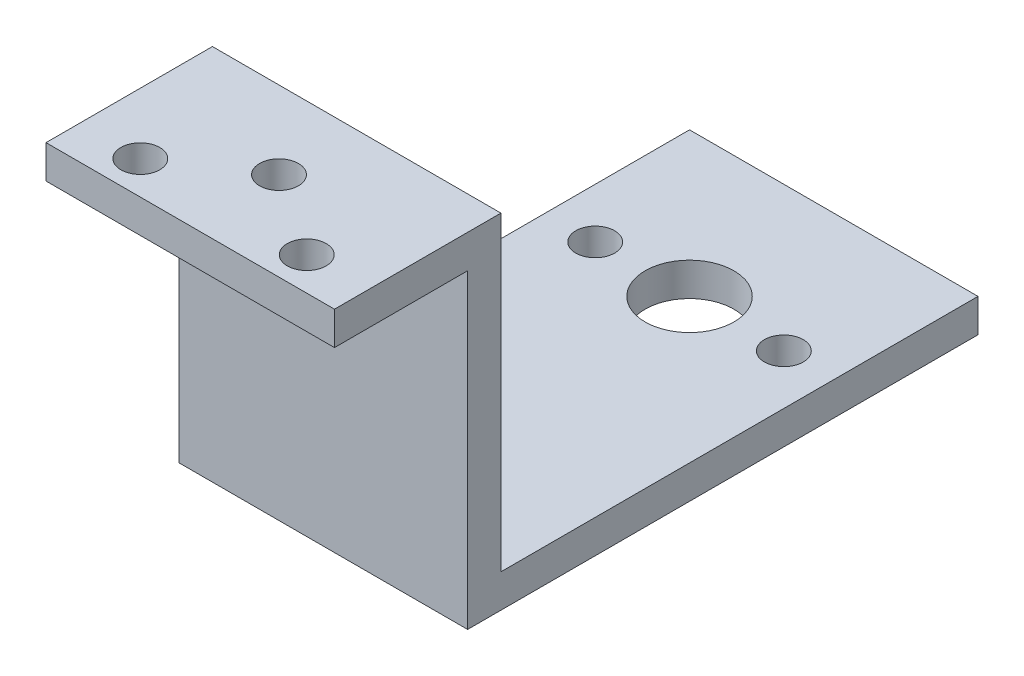
ISO-10303-21;
HEADER;
FILE_DESCRIPTION(('STEP AP214'),'2;1');
FILE_NAME('part.step','',(''),(''),'','','');
FILE_SCHEMA(('AUTOMOTIVE_DESIGN { 1 0 10303 214 1 1 1 1 }'));
ENDSEC;
DATA;
#1=APPLICATION_CONTEXT('core data for automotive mechanical design processes');
#2=APPLICATION_PROTOCOL_DEFINITION('international standard','automotive_design',2000,#1);
#3=PRODUCT_CONTEXT('',#1,'mechanical');
#4=PRODUCT('Part','Part','',(#3));
#5=PRODUCT_RELATED_PRODUCT_CATEGORY('part','',(#4));
#6=PRODUCT_DEFINITION_FORMATION('','',#4);
#7=PRODUCT_DEFINITION_CONTEXT('part definition',#1,'design');
#8=PRODUCT_DEFINITION('design','',#6,#7);
#9=PRODUCT_DEFINITION_SHAPE('','',#8);
#10=(LENGTH_UNIT() NAMED_UNIT(*) SI_UNIT(.MILLI.,.METRE.));
#11=(NAMED_UNIT(*) PLANE_ANGLE_UNIT() SI_UNIT($,.RADIAN.));
#12=(NAMED_UNIT(*) SI_UNIT($,.STERADIAN.) SOLID_ANGLE_UNIT());
#13=UNCERTAINTY_MEASURE_WITH_UNIT(LENGTH_MEASURE(1.E-05),#10,'distance_accuracy_value','');
#14=(GEOMETRIC_REPRESENTATION_CONTEXT(3) GLOBAL_UNCERTAINTY_ASSIGNED_CONTEXT((#13)) GLOBAL_UNIT_ASSIGNED_CONTEXT((#10,
#11,#12)) REPRESENTATION_CONTEXT('',''));
#15=CARTESIAN_POINT('',(0.,0.,0.));
#16=DIRECTION('',(0.,0.,1.));
#17=DIRECTION('',(1.,0.,0.));
#18=AXIS2_PLACEMENT_3D('',#15,#16,#17);
#19=CARTESIAN_POINT('',(0.,3.,0.));
#20=DIRECTION('',(0.,1.,0.));
#21=DIRECTION('',(0.,0.,1.));
#22=AXIS2_PLACEMENT_3D('',#19,#20,#21);
#23=PLANE('',#22);
#24=CARTESIAN_POINT('',(8.5,3.,0.));
#25=DIRECTION('',(0.,1.,0.));
#26=DIRECTION('',(0.,0.,1.));
#27=AXIS2_PLACEMENT_3D('',#24,#25,#26);
#28=CIRCLE('',#27,1.75);
#29=CARTESIAN_POINT('',(8.5,3.,1.75));
#30=VERTEX_POINT('',#29);
#31=EDGE_CURVE('E248',#30,#30,#28,.T.);
#32=ORIENTED_EDGE('',*,*,#31,.F.);
#33=EDGE_LOOP('',(#32));
#34=FACE_BOUND('',#33,.T.);
#35=DIRECTION('',(0.,0.,-1.));
#36=VECTOR('',#35,1.);
#37=CARTESIAN_POINT('',(13.,3.,30.));
#38=LINE('',#37,#36);
#39=CARTESIAN_POINT('',(13.,3.,30.));
#40=VERTEX_POINT('',#39);
#41=CARTESIAN_POINT('',(13.,3.,-13.));
#42=VERTEX_POINT('',#41);
#43=EDGE_CURVE('E14',#40,#42,#38,.T.);
#44=ORIENTED_EDGE('',*,*,#43,.T.);
#45=DIRECTION('',(1.,0.,0.));
#46=VECTOR('',#45,1.);
#47=CARTESIAN_POINT('',(0.,3.,-13.));
#48=LINE('',#47,#46);
#49=CARTESIAN_POINT('',(-13.,3.,-13.));
#50=VERTEX_POINT('',#49);
#51=EDGE_CURVE('E143',#50,#42,#48,.T.);
#52=ORIENTED_EDGE('',*,*,#51,.F.);
#53=DIRECTION('',(0.,0.,1.));
#54=VECTOR('',#53,1.);
#55=CARTESIAN_POINT('',(-13.,3.,0.));
#56=LINE('',#55,#54);
#57=CARTESIAN_POINT('',(-13.,3.,30.));
#58=VERTEX_POINT('',#57);
#59=EDGE_CURVE('E264',#50,#58,#56,.T.);
#60=ORIENTED_EDGE('',*,*,#59,.T.);
#61=DIRECTION('',(1.,0.,0.));
#62=VECTOR('',#61,1.);
#63=CARTESIAN_POINT('',(-13.,3.,30.));
#64=LINE('',#63,#62);
#65=EDGE_CURVE('E85',#58,#40,#64,.T.);
#66=ORIENTED_EDGE('',*,*,#65,.T.);
#67=EDGE_LOOP('',(#44,#52,#60,#66));
#68=FACE_BOUND('',#67,.T.);
#69=CARTESIAN_POINT('',(0.,3.,0.));
#70=DIRECTION('',(0.,1.,0.));
#71=DIRECTION('',(0.,0.,1.));
#72=AXIS2_PLACEMENT_3D('',#69,#70,#71);
#73=CIRCLE('',#72,4.);
#74=CARTESIAN_POINT('',(0.,3.,4.));
#75=VERTEX_POINT('',#74);
#76=EDGE_CURVE('E256',#75,#75,#73,.T.);
#77=ORIENTED_EDGE('',*,*,#76,.F.);
#78=EDGE_LOOP('',(#77));
#79=FACE_BOUND('',#78,.T.);
#80=CARTESIAN_POINT('',(-8.5,3.,0.));
#81=DIRECTION('',(0.,1.,0.));
#82=DIRECTION('',(0.,0.,1.));
#83=AXIS2_PLACEMENT_3D('',#80,#81,#82);
#84=CIRCLE('',#83,1.75);
#85=CARTESIAN_POINT('',(-8.5,3.,1.75));
#86=VERTEX_POINT('',#85);
#87=EDGE_CURVE('E240',#86,#86,#84,.T.);
#88=ORIENTED_EDGE('',*,*,#87,.F.);
#89=EDGE_LOOP('',(#88));
#90=FACE_BOUND('',#89,.T.);
#91=ADVANCED_FACE('F75',(#34,#68,#79,#90),#23,.T.);
#92=CARTESIAN_POINT('',(0.,0.,0.));
#93=DIRECTION('',(0.,1.,0.));
#94=DIRECTION('',(0.,0.,1.));
#95=AXIS2_PLACEMENT_3D('',#92,#93,#94);
#96=PLANE('',#95);
#97=DIRECTION('',(1.,0.,0.));
#98=VECTOR('',#97,1.);
#99=CARTESIAN_POINT('',(0.,0.,-13.));
#100=LINE('',#99,#98);
#101=CARTESIAN_POINT('',(-13.,0.,-13.));
#102=VERTEX_POINT('',#101);
#103=CARTESIAN_POINT('',(13.,0.,-13.));
#104=VERTEX_POINT('',#103);
#105=EDGE_CURVE('E155',#102,#104,#100,.T.);
#106=ORIENTED_EDGE('',*,*,#105,.T.);
#107=DIRECTION('',(0.,0.,-1.));
#108=VECTOR('',#107,1.);
#109=CARTESIAN_POINT('',(13.,0.,30.));
#110=LINE('',#109,#108);
#111=CARTESIAN_POINT('',(13.,0.,33.));
#112=VERTEX_POINT('',#111);
#113=EDGE_CURVE('E79',#112,#104,#110,.T.);
#114=ORIENTED_EDGE('',*,*,#113,.F.);
#115=DIRECTION('',(1.,0.,0.));
#116=VECTOR('',#115,1.);
#117=CARTESIAN_POINT('',(-47.4383507154451,0.,33.));
#118=LINE('',#117,#116);
#119=CARTESIAN_POINT('',(-13.,0.,33.));
#120=VERTEX_POINT('',#119);
#121=EDGE_CURVE('E195',#120,#112,#118,.T.);
#122=ORIENTED_EDGE('',*,*,#121,.F.);
#123=DIRECTION('',(0.,0.,1.));
#124=VECTOR('',#123,1.);
#125=CARTESIAN_POINT('',(-13.,0.,0.));
#126=LINE('',#125,#124);
#127=EDGE_CURVE('E260',#102,#120,#126,.T.);
#128=ORIENTED_EDGE('',*,*,#127,.F.);
#129=EDGE_LOOP('',(#106,#114,#122,#128));
#130=FACE_BOUND('',#129,.T.);
#131=CARTESIAN_POINT('',(0.,0.,0.));
#132=DIRECTION('',(0.,1.,0.));
#133=DIRECTION('',(0.,0.,1.));
#134=AXIS2_PLACEMENT_3D('',#131,#132,#133);
#135=CIRCLE('',#134,4.);
#136=CARTESIAN_POINT('',(0.,0.,4.));
#137=VERTEX_POINT('',#136);
#138=EDGE_CURVE('E252',#137,#137,#135,.T.);
#139=ORIENTED_EDGE('',*,*,#138,.T.);
#140=EDGE_LOOP('',(#139));
#141=FACE_BOUND('',#140,.T.);
#142=CARTESIAN_POINT('',(8.5,0.,0.));
#143=DIRECTION('',(0.,1.,0.));
#144=DIRECTION('',(0.,0.,1.));
#145=AXIS2_PLACEMENT_3D('',#142,#143,#144);
#146=CIRCLE('',#145,1.75);
#147=CARTESIAN_POINT('',(8.5,0.,1.75));
#148=VERTEX_POINT('',#147);
#149=EDGE_CURVE('E244',#148,#148,#146,.T.);
#150=ORIENTED_EDGE('',*,*,#149,.T.);
#151=EDGE_LOOP('',(#150));
#152=FACE_BOUND('',#151,.T.);
#153=CARTESIAN_POINT('',(-8.5,0.,0.));
#154=DIRECTION('',(0.,1.,0.));
#155=DIRECTION('',(0.,0.,1.));
#156=AXIS2_PLACEMENT_3D('',#153,#154,#155);
#157=CIRCLE('',#156,1.75);
#158=CARTESIAN_POINT('',(-8.5,0.,1.75));
#159=VERTEX_POINT('',#158);
#160=EDGE_CURVE('E239',#159,#159,#157,.T.);
#161=ORIENTED_EDGE('',*,*,#160,.T.);
#162=EDGE_LOOP('',(#161));
#163=FACE_BOUND('',#162,.T.);
#164=ADVANCED_FACE('F343',(#130,#141,#152,#163),#96,.F.);
#165=CARTESIAN_POINT('',(-13.,3.,0.));
#166=DIRECTION('',(1.,0.,0.));
#167=DIRECTION('',(0.,0.,-1.));
#168=AXIS2_PLACEMENT_3D('',#165,#166,#167);
#169=PLANE('',#168);
#170=ORIENTED_EDGE('',*,*,#127,.T.);
#171=DIRECTION('',(0.,1.,0.));
#172=VECTOR('',#171,1.);
#173=CARTESIAN_POINT('',(-13.,28.,33.));
#174=LINE('',#173,#172);
#175=CARTESIAN_POINT('',(-13.,28.,33.));
#176=VERTEX_POINT('',#175);
#177=EDGE_CURVE('E201',#120,#176,#174,.T.);
#178=ORIENTED_EDGE('',*,*,#177,.T.);
#179=DIRECTION('',(0.,0.,1.));
#180=VECTOR('',#179,1.);
#181=CARTESIAN_POINT('',(-13.,28.,45.));
#182=LINE('',#181,#180);
#183=CARTESIAN_POINT('',(-13.,28.,45.));
#184=VERTEX_POINT('',#183);
#185=EDGE_CURVE('E198',#176,#184,#182,.T.);
#186=ORIENTED_EDGE('',*,*,#185,.T.);
#187=DIRECTION('',(0.,1.,0.));
#188=VECTOR('',#187,1.);
#189=CARTESIAN_POINT('',(-13.,31.,45.));
#190=LINE('',#189,#188);
#191=CARTESIAN_POINT('',(-13.,31.,45.));
#192=VERTEX_POINT('',#191);
#193=EDGE_CURVE('E194',#184,#192,#190,.T.);
#194=ORIENTED_EDGE('',*,*,#193,.T.);
#195=DIRECTION('',(0.,0.,-1.));
#196=VECTOR('',#195,1.);
#197=CARTESIAN_POINT('',(-13.,31.,30.));
#198=LINE('',#197,#196);
#199=CARTESIAN_POINT('',(-13.,31.,30.));
#200=VERTEX_POINT('',#199);
#201=EDGE_CURVE('E191',#192,#200,#198,.T.);
#202=ORIENTED_EDGE('',*,*,#201,.T.);
#203=DIRECTION('',(0.,-1.,0.));
#204=VECTOR('',#203,1.);
#205=CARTESIAN_POINT('',(-13.,3.,30.));
#206=LINE('',#205,#204);
#207=EDGE_CURVE('E204',#200,#58,#206,.T.);
#208=ORIENTED_EDGE('',*,*,#207,.T.);
#209=ORIENTED_EDGE('',*,*,#59,.F.);
#210=DIRECTION('',(0.,-1.,0.));
#211=VECTOR('',#210,1.);
#212=CARTESIAN_POINT('',(-13.,21.3847763108502,-13.));
#213=LINE('',#212,#211);
#214=EDGE_CURVE('E153',#50,#102,#213,.T.);
#215=ORIENTED_EDGE('',*,*,#214,.T.);
#216=EDGE_LOOP('',(#170,#178,#186,#194,#202,#208,#209,#215));
#217=FACE_BOUND('',#216,.T.);
#218=ADVANCED_FACE('F77',(#217),#169,.F.);
#219=CARTESIAN_POINT('',(13.,3.,30.));
#220=DIRECTION('',(-1.,0.,0.));
#221=DIRECTION('',(0.,0.,1.));
#222=AXIS2_PLACEMENT_3D('',#219,#220,#221);
#223=PLANE('',#222);
#224=ORIENTED_EDGE('',*,*,#113,.T.);
#225=DIRECTION('',(0.,-1.,0.));
#226=VECTOR('',#225,1.);
#227=CARTESIAN_POINT('',(13.,21.3847763108502,-13.));
#228=LINE('',#227,#226);
#229=EDGE_CURVE('E151',#42,#104,#228,.T.);
#230=ORIENTED_EDGE('',*,*,#229,.F.);
#231=ORIENTED_EDGE('',*,*,#43,.F.);
#232=DIRECTION('',(0.,1.,0.));
#233=VECTOR('',#232,1.);
#234=CARTESIAN_POINT('',(13.,3.,30.));
#235=LINE('',#234,#233);
#236=CARTESIAN_POINT('',(13.,31.,30.));
#237=VERTEX_POINT('',#236);
#238=EDGE_CURVE('E93',#40,#237,#235,.T.);
#239=ORIENTED_EDGE('',*,*,#238,.T.);
#240=DIRECTION('',(0.,0.,1.));
#241=VECTOR('',#240,1.);
#242=CARTESIAN_POINT('',(13.,31.,30.));
#243=LINE('',#242,#241);
#244=CARTESIAN_POINT('',(13.,31.,45.));
#245=VERTEX_POINT('',#244);
#246=EDGE_CURVE('E207',#237,#245,#243,.T.);
#247=ORIENTED_EDGE('',*,*,#246,.T.);
#248=DIRECTION('',(0.,-1.,0.));
#249=VECTOR('',#248,1.);
#250=CARTESIAN_POINT('',(13.,31.,45.));
#251=LINE('',#250,#249);
#252=CARTESIAN_POINT('',(13.,28.,45.));
#253=VERTEX_POINT('',#252);
#254=EDGE_CURVE('E211',#245,#253,#251,.T.);
#255=ORIENTED_EDGE('',*,*,#254,.T.);
#256=DIRECTION('',(0.,0.,-1.));
#257=VECTOR('',#256,1.);
#258=CARTESIAN_POINT('',(13.,28.,45.));
#259=LINE('',#258,#257);
#260=CARTESIAN_POINT('',(13.,28.,33.));
#261=VERTEX_POINT('',#260);
#262=EDGE_CURVE('E215',#253,#261,#259,.T.);
#263=ORIENTED_EDGE('',*,*,#262,.T.);
#264=DIRECTION('',(0.,-1.,0.));
#265=VECTOR('',#264,1.);
#266=CARTESIAN_POINT('',(13.,28.,33.));
#267=LINE('',#266,#265);
#268=EDGE_CURVE('E219',#261,#112,#267,.T.);
#269=ORIENTED_EDGE('',*,*,#268,.T.);
#270=EDGE_LOOP('',(#224,#230,#231,#239,#247,#255,#263,#269));
#271=FACE_BOUND('',#270,.T.);
#272=ADVANCED_FACE('F157',(#271),#223,.F.);
#273=CARTESIAN_POINT('',(0.,3.,0.));
#274=DIRECTION('',(0.,-1.,0.));
#275=DIRECTION('',(0.,0.,-1.));
#276=AXIS2_PLACEMENT_3D('',#273,#274,#275);
#277=CYLINDRICAL_SURFACE('',#276,4.);
#278=ORIENTED_EDGE('',*,*,#76,.T.);
#279=EDGE_LOOP('',(#278));
#280=FACE_BOUND('',#279,.T.);
#281=ORIENTED_EDGE('',*,*,#138,.F.);
#282=EDGE_LOOP('',(#281));
#283=FACE_BOUND('',#282,.T.);
#284=ADVANCED_FACE('F364',(#280,#283),#277,.F.);
#285=CARTESIAN_POINT('',(8.5,3.,0.));
#286=DIRECTION('',(0.,-1.,0.));
#287=DIRECTION('',(0.,0.,-1.));
#288=AXIS2_PLACEMENT_3D('',#285,#286,#287);
#289=CYLINDRICAL_SURFACE('',#288,1.75);
#290=ORIENTED_EDGE('',*,*,#31,.T.);
#291=EDGE_LOOP('',(#290));
#292=FACE_BOUND('',#291,.T.);
#293=ORIENTED_EDGE('',*,*,#149,.F.);
#294=EDGE_LOOP('',(#293));
#295=FACE_BOUND('',#294,.T.);
#296=ADVANCED_FACE('F356',(#292,#295),#289,.F.);
#297=CARTESIAN_POINT('',(-8.5,3.,0.));
#298=DIRECTION('',(0.,-1.,0.));
#299=DIRECTION('',(0.,0.,-1.));
#300=AXIS2_PLACEMENT_3D('',#297,#298,#299);
#301=CYLINDRICAL_SURFACE('',#300,1.75);
#302=ORIENTED_EDGE('',*,*,#87,.T.);
#303=EDGE_LOOP('',(#302));
#304=FACE_BOUND('',#303,.T.);
#305=ORIENTED_EDGE('',*,*,#160,.F.);
#306=EDGE_LOOP('',(#305));
#307=FACE_BOUND('',#306,.T.);
#308=ADVANCED_FACE('F353',(#304,#307),#301,.F.);
#309=CARTESIAN_POINT('',(-47.4383507154451,3.,30.));
#310=DIRECTION('',(0.,0.,-1.));
#311=DIRECTION('',(-1.,0.,0.));
#312=AXIS2_PLACEMENT_3D('',#309,#310,#311);
#313=PLANE('',#312);
#314=ORIENTED_EDGE('',*,*,#65,.F.);
#315=ORIENTED_EDGE('',*,*,#207,.F.);
#316=DIRECTION('',(1.,0.,0.));
#317=VECTOR('',#316,1.);
#318=CARTESIAN_POINT('',(-47.4383507154451,31.,30.));
#319=LINE('',#318,#317);
#320=EDGE_CURVE('E222',#200,#237,#319,.T.);
#321=ORIENTED_EDGE('',*,*,#320,.T.);
#322=ORIENTED_EDGE('',*,*,#238,.F.);
#323=EDGE_LOOP('',(#314,#315,#321,#322));
#324=FACE_BOUND('',#323,.T.);
#325=ADVANCED_FACE('F355',(#324),#313,.T.);
#326=CARTESIAN_POINT('',(-47.4383507154451,28.,33.));
#327=DIRECTION('',(0.,0.,1.));
#328=DIRECTION('',(1.,0.,0.));
#329=AXIS2_PLACEMENT_3D('',#326,#327,#328);
#330=PLANE('',#329);
#331=ORIENTED_EDGE('',*,*,#177,.F.);
#332=ORIENTED_EDGE('',*,*,#121,.T.);
#333=ORIENTED_EDGE('',*,*,#268,.F.);
#334=DIRECTION('',(1.,0.,0.));
#335=VECTOR('',#334,1.);
#336=CARTESIAN_POINT('',(-47.4383507154451,28.,33.));
#337=LINE('',#336,#335);
#338=EDGE_CURVE('E226',#176,#261,#337,.T.);
#339=ORIENTED_EDGE('',*,*,#338,.F.);
#340=EDGE_LOOP('',(#331,#332,#333,#339));
#341=FACE_BOUND('',#340,.T.);
#342=ADVANCED_FACE('F341',(#341),#330,.T.);
#343=CARTESIAN_POINT('',(-47.4383507154451,28.,45.));
#344=DIRECTION('',(0.,-1.,0.));
#345=DIRECTION('',(0.,0.,-1.));
#346=AXIS2_PLACEMENT_3D('',#343,#344,#345);
#347=PLANE('',#346);
#348=CARTESIAN_POINT('',(7.49999999999998,28.,42.));
#349=DIRECTION('',(0.,-1.,0.));
#350=DIRECTION('',(0.,0.,-1.));
#351=AXIS2_PLACEMENT_3D('',#348,#349,#350);
#352=CIRCLE('',#351,1.75);
#353=CARTESIAN_POINT('',(7.49999999999998,28.,40.25));
#354=VERTEX_POINT('',#353);
#355=EDGE_CURVE('E172',#354,#354,#352,.T.);
#356=ORIENTED_EDGE('',*,*,#355,.F.);
#357=EDGE_LOOP('',(#356));
#358=FACE_BOUND('',#357,.T.);
#359=CARTESIAN_POINT('',(0.,28.,37.));
#360=DIRECTION('',(0.,-1.,0.));
#361=DIRECTION('',(0.,0.,-1.));
#362=AXIS2_PLACEMENT_3D('',#359,#360,#361);
#363=CIRCLE('',#362,1.75);
#364=CARTESIAN_POINT('',(0.,28.,35.25));
#365=VERTEX_POINT('',#364);
#366=EDGE_CURVE('E180',#365,#365,#363,.T.);
#367=ORIENTED_EDGE('',*,*,#366,.F.);
#368=EDGE_LOOP('',(#367));
#369=FACE_BOUND('',#368,.T.);
#370=CARTESIAN_POINT('',(-7.50000000000002,28.,42.));
#371=DIRECTION('',(0.,-1.,0.));
#372=DIRECTION('',(0.,0.,-1.));
#373=AXIS2_PLACEMENT_3D('',#370,#371,#372);
#374=CIRCLE('',#373,1.75);
#375=CARTESIAN_POINT('',(-7.50000000000002,28.,40.25));
#376=VERTEX_POINT('',#375);
#377=EDGE_CURVE('E167',#376,#376,#374,.T.);
#378=ORIENTED_EDGE('',*,*,#377,.F.);
#379=EDGE_LOOP('',(#378));
#380=FACE_BOUND('',#379,.T.);
#381=ORIENTED_EDGE('',*,*,#185,.F.);
#382=ORIENTED_EDGE('',*,*,#338,.T.);
#383=ORIENTED_EDGE('',*,*,#262,.F.);
#384=DIRECTION('',(1.,0.,0.));
#385=VECTOR('',#384,1.);
#386=CARTESIAN_POINT('',(-47.4383507154451,28.,45.));
#387=LINE('',#386,#385);
#388=EDGE_CURVE('E229',#184,#253,#387,.T.);
#389=ORIENTED_EDGE('',*,*,#388,.F.);
#390=EDGE_LOOP('',(#381,#382,#383,#389));
#391=FACE_BOUND('',#390,.T.);
#392=ADVANCED_FACE('F444',(#358,#369,#380,#391),#347,.T.);
#393=CARTESIAN_POINT('',(-47.4383507154451,31.,45.));
#394=DIRECTION('',(0.,0.,1.));
#395=DIRECTION('',(1.,0.,0.));
#396=AXIS2_PLACEMENT_3D('',#393,#394,#395);
#397=PLANE('',#396);
#398=ORIENTED_EDGE('',*,*,#193,.F.);
#399=ORIENTED_EDGE('',*,*,#388,.T.);
#400=ORIENTED_EDGE('',*,*,#254,.F.);
#401=DIRECTION('',(1.,0.,0.));
#402=VECTOR('',#401,1.);
#403=CARTESIAN_POINT('',(-47.4383507154451,31.,45.));
#404=LINE('',#403,#402);
#405=EDGE_CURVE('E232',#192,#245,#404,.T.);
#406=ORIENTED_EDGE('',*,*,#405,.F.);
#407=EDGE_LOOP('',(#398,#399,#400,#406));
#408=FACE_BOUND('',#407,.T.);
#409=ADVANCED_FACE('F436',(#408),#397,.T.);
#410=CARTESIAN_POINT('',(-47.4383507154451,31.,30.));
#411=DIRECTION('',(0.,1.,0.));
#412=DIRECTION('',(0.,0.,1.));
#413=AXIS2_PLACEMENT_3D('',#410,#411,#412);
#414=PLANE('',#413);
#415=CARTESIAN_POINT('',(7.49999999999998,31.,42.));
#416=DIRECTION('',(0.,-1.,0.));
#417=DIRECTION('',(0.,0.,-1.));
#418=AXIS2_PLACEMENT_3D('',#415,#416,#417);
#419=CIRCLE('',#418,1.75);
#420=CARTESIAN_POINT('',(7.49999999999998,31.,40.25));
#421=VERTEX_POINT('',#420);
#422=EDGE_CURVE('E168',#421,#421,#419,.T.);
#423=ORIENTED_EDGE('',*,*,#422,.T.);
#424=EDGE_LOOP('',(#423));
#425=FACE_BOUND('',#424,.T.);
#426=CARTESIAN_POINT('',(0.,31.,37.));
#427=DIRECTION('',(0.,-1.,0.));
#428=DIRECTION('',(0.,0.,-1.));
#429=AXIS2_PLACEMENT_3D('',#426,#427,#428);
#430=CIRCLE('',#429,1.75);
#431=CARTESIAN_POINT('',(0.,31.,35.25));
#432=VERTEX_POINT('',#431);
#433=EDGE_CURVE('E176',#432,#432,#430,.T.);
#434=ORIENTED_EDGE('',*,*,#433,.T.);
#435=EDGE_LOOP('',(#434));
#436=FACE_BOUND('',#435,.T.);
#437=CARTESIAN_POINT('',(-7.50000000000002,31.,42.));
#438=DIRECTION('',(0.,-1.,0.));
#439=DIRECTION('',(0.,0.,-1.));
#440=AXIS2_PLACEMENT_3D('',#437,#438,#439);
#441=CIRCLE('',#440,1.75);
#442=CARTESIAN_POINT('',(-7.50000000000002,31.,40.25));
#443=VERTEX_POINT('',#442);
#444=EDGE_CURVE('E184',#443,#443,#441,.T.);
#445=ORIENTED_EDGE('',*,*,#444,.T.);
#446=EDGE_LOOP('',(#445));
#447=FACE_BOUND('',#446,.T.);
#448=ORIENTED_EDGE('',*,*,#201,.F.);
#449=ORIENTED_EDGE('',*,*,#405,.T.);
#450=ORIENTED_EDGE('',*,*,#246,.F.);
#451=ORIENTED_EDGE('',*,*,#320,.F.);
#452=EDGE_LOOP('',(#448,#449,#450,#451));
#453=FACE_BOUND('',#452,.T.);
#454=ADVANCED_FACE('F425',(#425,#436,#447,#453),#414,.T.);
#455=CARTESIAN_POINT('',(-7.50000000000002,31.,42.));
#456=DIRECTION('',(0.,-1.,0.));
#457=DIRECTION('',(0.,0.,-1.));
#458=AXIS2_PLACEMENT_3D('',#455,#456,#457);
#459=CYLINDRICAL_SURFACE('',#458,1.75);
#460=ORIENTED_EDGE('',*,*,#444,.F.);
#461=EDGE_LOOP('',(#460));
#462=FACE_BOUND('',#461,.T.);
#463=ORIENTED_EDGE('',*,*,#377,.T.);
#464=EDGE_LOOP('',(#463));
#465=FACE_BOUND('',#464,.T.);
#466=ADVANCED_FACE('F414',(#462,#465),#459,.F.);
#467=CARTESIAN_POINT('',(0.,31.,37.));
#468=DIRECTION('',(0.,-1.,0.));
#469=DIRECTION('',(0.,0.,-1.));
#470=AXIS2_PLACEMENT_3D('',#467,#468,#469);
#471=CYLINDRICAL_SURFACE('',#470,1.75);
#472=ORIENTED_EDGE('',*,*,#433,.F.);
#473=EDGE_LOOP('',(#472));
#474=FACE_BOUND('',#473,.T.);
#475=ORIENTED_EDGE('',*,*,#366,.T.);
#476=EDGE_LOOP('',(#475));
#477=FACE_BOUND('',#476,.T.);
#478=ADVANCED_FACE('F403',(#474,#477),#471,.F.);
#479=CARTESIAN_POINT('',(7.49999999999998,31.,42.));
#480=DIRECTION('',(0.,-1.,0.));
#481=DIRECTION('',(0.,0.,-1.));
#482=AXIS2_PLACEMENT_3D('',#479,#480,#481);
#483=CYLINDRICAL_SURFACE('',#482,1.75);
#484=ORIENTED_EDGE('',*,*,#422,.F.);
#485=EDGE_LOOP('',(#484));
#486=FACE_BOUND('',#485,.T.);
#487=ORIENTED_EDGE('',*,*,#355,.T.);
#488=EDGE_LOOP('',(#487));
#489=FACE_BOUND('',#488,.T.);
#490=ADVANCED_FACE('F397',(#486,#489),#483,.F.);
#491=CARTESIAN_POINT('',(0.,21.3847763108502,-13.));
#492=DIRECTION('',(0.,0.,-1.));
#493=DIRECTION('',(-1.,0.,0.));
#494=AXIS2_PLACEMENT_3D('',#491,#492,#493);
#495=PLANE('',#494);
#496=ORIENTED_EDGE('',*,*,#214,.F.);
#497=ORIENTED_EDGE('',*,*,#51,.T.);
#498=ORIENTED_EDGE('',*,*,#229,.T.);
#499=ORIENTED_EDGE('',*,*,#105,.F.);
#500=EDGE_LOOP('',(#496,#497,#498,#499));
#501=FACE_BOUND('',#500,.T.);
#502=ADVANCED_FACE('F149',(#501),#495,.T.);
#503=CLOSED_SHELL('',(#91,#164,#218,#272,#284,#296,#308,#325,#342,#392,#409,#454,#466,#478,#490,#502));
#504=MANIFOLD_SOLID_BREP('B2',#503);
#505=ADVANCED_BREP_SHAPE_REPRESENTATION('',(#18,#504),#14);
#506=SHAPE_DEFINITION_REPRESENTATION(#9,#505);
ENDSEC;
END-ISO-10303-21;
